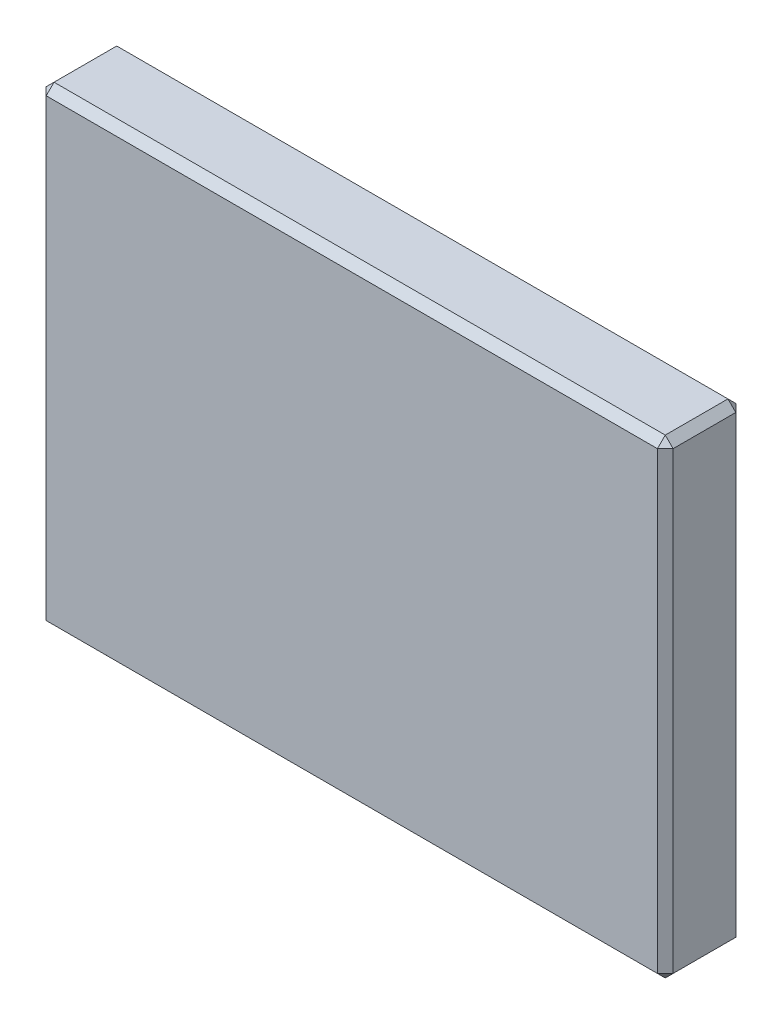
ISO-10303-21;
HEADER;
FILE_DESCRIPTION(('STEP AP214'),'2;1');
FILE_NAME('part.step','',(''),(''),'','','');
FILE_SCHEMA(('AUTOMOTIVE_DESIGN { 1 0 10303 214 1 1 1 1 }'));
ENDSEC;
DATA;
#1=APPLICATION_CONTEXT('core data for automotive mechanical design processes');
#2=APPLICATION_PROTOCOL_DEFINITION('international standard','automotive_design',2000,#1);
#3=PRODUCT_CONTEXT('',#1,'mechanical');
#4=PRODUCT('Part','Part','',(#3));
#5=PRODUCT_RELATED_PRODUCT_CATEGORY('part','',(#4));
#6=PRODUCT_DEFINITION_FORMATION('','',#4);
#7=PRODUCT_DEFINITION_CONTEXT('part definition',#1,'design');
#8=PRODUCT_DEFINITION('design','',#6,#7);
#9=PRODUCT_DEFINITION_SHAPE('','',#8);
#10=(LENGTH_UNIT() NAMED_UNIT(*) SI_UNIT(.MILLI.,.METRE.));
#11=(NAMED_UNIT(*) PLANE_ANGLE_UNIT() SI_UNIT($,.RADIAN.));
#12=(NAMED_UNIT(*) SI_UNIT($,.STERADIAN.) SOLID_ANGLE_UNIT());
#13=UNCERTAINTY_MEASURE_WITH_UNIT(LENGTH_MEASURE(1.E-05),#10,'distance_accuracy_value','');
#14=(GEOMETRIC_REPRESENTATION_CONTEXT(3) GLOBAL_UNCERTAINTY_ASSIGNED_CONTEXT((#13)) GLOBAL_UNIT_ASSIGNED_CONTEXT((#10,
#11,#12)) REPRESENTATION_CONTEXT('',''));
#15=CARTESIAN_POINT('',(0.,0.,0.));
#16=DIRECTION('',(0.,0.,1.));
#17=DIRECTION('',(1.,0.,0.));
#18=AXIS2_PLACEMENT_3D('',#15,#16,#17);
#19=CARTESIAN_POINT('',(0.,0.,12.7));
#20=DIRECTION('',(1.,0.,0.));
#21=DIRECTION('',(0.,0.,-1.));
#22=AXIS2_PLACEMENT_3D('',#19,#20,#21);
#23=PLANE('',#22);
#24=DIRECTION('',(0.,1.,0.));
#25=VECTOR('',#24,1.);
#26=CARTESIAN_POINT('',(0.,0.,11.43));
#27=LINE('',#26,#25);
#28=CARTESIAN_POINT('',(0.,1.27000000000001,11.43));
#29=VERTEX_POINT('',#28);
#30=CARTESIAN_POINT('',(0.,74.93,11.43));
#31=VERTEX_POINT('',#30);
#32=EDGE_CURVE('E159',#29,#31,#27,.T.);
#33=ORIENTED_EDGE('',*,*,#32,.T.);
#34=DIRECTION('',(0.,0.,-1.));
#35=VECTOR('',#34,1.);
#36=CARTESIAN_POINT('',(0.,74.93,12.7));
#37=LINE('',#36,#35);
#38=CARTESIAN_POINT('',(0.,74.93,1.27000000000001));
#39=VERTEX_POINT('',#38);
#40=EDGE_CURVE('E162',#31,#39,#37,.T.);
#41=ORIENTED_EDGE('',*,*,#40,.T.);
#42=DIRECTION('',(0.,-1.,0.));
#43=VECTOR('',#42,1.);
#44=CARTESIAN_POINT('',(0.,0.,1.27000000000001));
#45=LINE('',#44,#43);
#46=CARTESIAN_POINT('',(0.,1.27000000000001,1.27000000000001));
#47=VERTEX_POINT('',#46);
#48=EDGE_CURVE('E136',#39,#47,#45,.T.);
#49=ORIENTED_EDGE('',*,*,#48,.T.);
#50=DIRECTION('',(0.,0.,1.));
#51=VECTOR('',#50,1.);
#52=CARTESIAN_POINT('',(0.,1.27000000000001,12.7));
#53=LINE('',#52,#51);
#54=EDGE_CURVE('E152',#47,#29,#53,.T.);
#55=ORIENTED_EDGE('',*,*,#54,.T.);
#56=EDGE_LOOP('',(#33,#41,#49,#55));
#57=FACE_BOUND('',#56,.T.);
#58=ADVANCED_FACE('F41',(#57),#23,.F.);
#59=CARTESIAN_POINT('',(0.,0.,12.7));
#60=DIRECTION('',(0.,1.,0.));
#61=DIRECTION('',(0.,0.,1.));
#62=AXIS2_PLACEMENT_3D('',#59,#60,#61);
#63=PLANE('',#62);
#64=DIRECTION('',(0.,0.,-1.));
#65=VECTOR('',#64,1.);
#66=CARTESIAN_POINT('',(1.26999999999999,0.,12.7));
#67=LINE('',#66,#65);
#68=CARTESIAN_POINT('',(1.26999999999999,0.,11.43));
#69=VERTEX_POINT('',#68);
#70=CARTESIAN_POINT('',(1.26999999999999,0.,1.26999999999999));
#71=VERTEX_POINT('',#70);
#72=EDGE_CURVE('E176',#69,#71,#67,.T.);
#73=ORIENTED_EDGE('',*,*,#72,.T.);
#74=DIRECTION('',(1.,0.,0.));
#75=VECTOR('',#74,1.);
#76=CARTESIAN_POINT('',(101.6,0.,1.26999999999999));
#77=LINE('',#76,#75);
#78=CARTESIAN_POINT('',(100.33,0.,1.26999999999999));
#79=VERTEX_POINT('',#78);
#80=EDGE_CURVE('E185',#71,#79,#77,.T.);
#81=ORIENTED_EDGE('',*,*,#80,.T.);
#82=DIRECTION('',(0.,0.,1.));
#83=VECTOR('',#82,1.);
#84=CARTESIAN_POINT('',(100.33,0.,12.7));
#85=LINE('',#84,#83);
#86=CARTESIAN_POINT('',(100.33,0.,11.43));
#87=VERTEX_POINT('',#86);
#88=EDGE_CURVE('E179',#79,#87,#85,.T.);
#89=ORIENTED_EDGE('',*,*,#88,.T.);
#90=DIRECTION('',(-1.,0.,0.));
#91=VECTOR('',#90,1.);
#92=CARTESIAN_POINT('',(0.,0.,11.43));
#93=LINE('',#92,#91);
#94=EDGE_CURVE('E177',#87,#69,#93,.T.);
#95=ORIENTED_EDGE('',*,*,#94,.T.);
#96=EDGE_LOOP('',(#73,#81,#89,#95));
#97=FACE_BOUND('',#96,.T.);
#98=ADVANCED_FACE('F335',(#97),#63,.F.);
#99=CARTESIAN_POINT('',(101.6,0.,12.7));
#100=DIRECTION('',(-1.,0.,0.));
#101=DIRECTION('',(0.,0.,1.));
#102=AXIS2_PLACEMENT_3D('',#99,#100,#101);
#103=PLANE('',#102);
#104=DIRECTION('',(0.,0.,-1.));
#105=VECTOR('',#104,1.);
#106=CARTESIAN_POINT('',(101.6,1.27000000000001,12.7));
#107=LINE('',#106,#105);
#108=CARTESIAN_POINT('',(101.6,1.27000000000001,11.43));
#109=VERTEX_POINT('',#108);
#110=CARTESIAN_POINT('',(101.6,1.27000000000001,1.26999999999999));
#111=VERTEX_POINT('',#110);
#112=EDGE_CURVE('E183',#109,#111,#107,.T.);
#113=ORIENTED_EDGE('',*,*,#112,.T.);
#114=DIRECTION('',(0.,1.,0.));
#115=VECTOR('',#114,1.);
#116=CARTESIAN_POINT('',(101.6,76.2,1.26999999999999));
#117=LINE('',#116,#115);
#118=CARTESIAN_POINT('',(101.6,74.93,1.26999999999999));
#119=VERTEX_POINT('',#118);
#120=EDGE_CURVE('E191',#111,#119,#117,.T.);
#121=ORIENTED_EDGE('',*,*,#120,.T.);
#122=DIRECTION('',(0.,0.,1.));
#123=VECTOR('',#122,1.);
#124=CARTESIAN_POINT('',(101.6,74.93,12.7));
#125=LINE('',#124,#123);
#126=CARTESIAN_POINT('',(101.6,74.93,11.43));
#127=VERTEX_POINT('',#126);
#128=EDGE_CURVE('E186',#119,#127,#125,.T.);
#129=ORIENTED_EDGE('',*,*,#128,.T.);
#130=DIRECTION('',(0.,-1.,0.));
#131=VECTOR('',#130,1.);
#132=CARTESIAN_POINT('',(101.6,0.,11.43));
#133=LINE('',#132,#131);
#134=EDGE_CURVE('E190',#127,#109,#133,.T.);
#135=ORIENTED_EDGE('',*,*,#134,.T.);
#136=EDGE_LOOP('',(#113,#121,#129,#135));
#137=FACE_BOUND('',#136,.T.);
#138=ADVANCED_FACE('F305',(#137),#103,.F.);
#139=CARTESIAN_POINT('',(0.,76.2,12.7));
#140=DIRECTION('',(0.,-1.,0.));
#141=DIRECTION('',(0.,0.,-1.));
#142=AXIS2_PLACEMENT_3D('',#139,#140,#141);
#143=PLANE('',#142);
#144=DIRECTION('',(0.,0.,-1.));
#145=VECTOR('',#144,1.);
#146=CARTESIAN_POINT('',(100.33,76.2,12.7));
#147=LINE('',#146,#145);
#148=CARTESIAN_POINT('',(100.33,76.2,11.43));
#149=VERTEX_POINT('',#148);
#150=CARTESIAN_POINT('',(100.33,76.2,1.26999999999999));
#151=VERTEX_POINT('',#150);
#152=EDGE_CURVE('E193',#149,#151,#147,.T.);
#153=ORIENTED_EDGE('',*,*,#152,.T.);
#154=DIRECTION('',(-1.,0.,0.));
#155=VECTOR('',#154,1.);
#156=CARTESIAN_POINT('',(0.,76.2,1.26999999999999));
#157=LINE('',#156,#155);
#158=CARTESIAN_POINT('',(1.26999999999999,76.2,1.26999999999999));
#159=VERTEX_POINT('',#158);
#160=EDGE_CURVE('E199',#151,#159,#157,.T.);
#161=ORIENTED_EDGE('',*,*,#160,.T.);
#162=DIRECTION('',(0.,0.,1.));
#163=VECTOR('',#162,1.);
#164=CARTESIAN_POINT('',(1.26999999999999,76.2,12.7));
#165=LINE('',#164,#163);
#166=CARTESIAN_POINT('',(1.26999999999999,76.2,11.43));
#167=VERTEX_POINT('',#166);
#168=EDGE_CURVE('E196',#159,#167,#165,.T.);
#169=ORIENTED_EDGE('',*,*,#168,.T.);
#170=DIRECTION('',(1.,0.,0.));
#171=VECTOR('',#170,1.);
#172=CARTESIAN_POINT('',(0.,76.2,11.43));
#173=LINE('',#172,#171);
#174=EDGE_CURVE('E198',#167,#149,#173,.T.);
#175=ORIENTED_EDGE('',*,*,#174,.T.);
#176=EDGE_LOOP('',(#153,#161,#169,#175));
#177=FACE_BOUND('',#176,.T.);
#178=ADVANCED_FACE('F274',(#177),#143,.F.);
#179=CARTESIAN_POINT('',(0.,0.,12.7));
#180=DIRECTION('',(0.,0.,-1.));
#181=DIRECTION('',(-1.,0.,0.));
#182=AXIS2_PLACEMENT_3D('',#179,#180,#181);
#183=PLANE('',#182);
#184=DIRECTION('',(-1.,0.,0.));
#185=VECTOR('',#184,1.);
#186=CARTESIAN_POINT('',(0.,74.93,12.7));
#187=LINE('',#186,#185);
#188=CARTESIAN_POINT('',(100.33,74.93,12.7));
#189=VERTEX_POINT('',#188);
#190=CARTESIAN_POINT('',(1.26999999999999,74.93,12.7));
#191=VERTEX_POINT('',#190);
#192=EDGE_CURVE('E51',#189,#191,#187,.T.);
#193=ORIENTED_EDGE('',*,*,#192,.T.);
#194=DIRECTION('',(0.,-1.,0.));
#195=VECTOR('',#194,1.);
#196=CARTESIAN_POINT('',(1.26999999999999,0.,12.7));
#197=LINE('',#196,#195);
#198=CARTESIAN_POINT('',(1.26999999999999,1.27000000000001,12.7));
#199=VERTEX_POINT('',#198);
#200=EDGE_CURVE('E11',#191,#199,#197,.T.);
#201=ORIENTED_EDGE('',*,*,#200,.T.);
#202=DIRECTION('',(1.,0.,0.));
#203=VECTOR('',#202,1.);
#204=CARTESIAN_POINT('',(0.,1.27000000000001,12.7));
#205=LINE('',#204,#203);
#206=CARTESIAN_POINT('',(100.33,1.27000000000001,12.7));
#207=VERTEX_POINT('',#206);
#208=EDGE_CURVE('E201',#199,#207,#205,.T.);
#209=ORIENTED_EDGE('',*,*,#208,.T.);
#210=DIRECTION('',(0.,1.,0.));
#211=VECTOR('',#210,1.);
#212=CARTESIAN_POINT('',(100.33,0.,12.7));
#213=LINE('',#212,#211);
#214=EDGE_CURVE('E65',#207,#189,#213,.T.);
#215=ORIENTED_EDGE('',*,*,#214,.T.);
#216=EDGE_LOOP('',(#193,#201,#209,#215));
#217=FACE_BOUND('',#216,.T.);
#218=ADVANCED_FACE('F289',(#217),#183,.F.);
#219=CARTESIAN_POINT('',(0.,0.,0.));
#220=DIRECTION('',(0.,0.,-1.));
#221=DIRECTION('',(-1.,0.,0.));
#222=AXIS2_PLACEMENT_3D('',#219,#220,#221);
#223=PLANE('',#222);
#224=DIRECTION('',(-1.,0.,0.));
#225=VECTOR('',#224,1.);
#226=CARTESIAN_POINT('',(0.,1.27000000000001,0.));
#227=LINE('',#226,#225);
#228=CARTESIAN_POINT('',(100.33,1.27000000000001,0.));
#229=VERTEX_POINT('',#228);
#230=CARTESIAN_POINT('',(1.26999999999999,1.27000000000001,0.));
#231=VERTEX_POINT('',#230);
#232=EDGE_CURVE('E174',#229,#231,#227,.T.);
#233=ORIENTED_EDGE('',*,*,#232,.T.);
#234=DIRECTION('',(0.,1.,0.));
#235=VECTOR('',#234,1.);
#236=CARTESIAN_POINT('',(1.26999999999999,76.2,0.));
#237=LINE('',#236,#235);
#238=CARTESIAN_POINT('',(1.26999999999999,74.93,0.));
#239=VERTEX_POINT('',#238);
#240=EDGE_CURVE('E137',#231,#239,#237,.T.);
#241=ORIENTED_EDGE('',*,*,#240,.T.);
#242=DIRECTION('',(1.,0.,0.));
#243=VECTOR('',#242,1.);
#244=CARTESIAN_POINT('',(101.6,74.93,0.));
#245=LINE('',#244,#243);
#246=CARTESIAN_POINT('',(100.33,74.93,0.));
#247=VERTEX_POINT('',#246);
#248=EDGE_CURVE('E167',#239,#247,#245,.T.);
#249=ORIENTED_EDGE('',*,*,#248,.T.);
#250=DIRECTION('',(0.,-1.,0.));
#251=VECTOR('',#250,1.);
#252=CARTESIAN_POINT('',(100.33,0.,0.));
#253=LINE('',#252,#251);
#254=EDGE_CURVE('E172',#247,#229,#253,.T.);
#255=ORIENTED_EDGE('',*,*,#254,.T.);
#256=EDGE_LOOP('',(#233,#241,#249,#255));
#257=FACE_BOUND('',#256,.T.);
#258=ADVANCED_FACE('F425',(#257),#223,.T.);
#259=CARTESIAN_POINT('',(100.33,0.,12.7));
#260=DIRECTION('',(-0.707106781186551,0.,-0.707106781186544));
#261=DIRECTION('',(0.,1.,0.));
#262=AXIS2_PLACEMENT_3D('',#259,#260,#261);
#263=PLANE('',#262);
#264=DIRECTION('',(-0.707106781186544,0.,0.707106781186551));
#265=VECTOR('',#264,1.);
#266=CARTESIAN_POINT('',(100.965,74.93,12.065));
#267=LINE('',#266,#265);
#268=EDGE_CURVE('E46',#189,#127,#267,.F.);
#269=ORIENTED_EDGE('',*,*,#268,.F.);
#270=ORIENTED_EDGE('',*,*,#214,.F.);
#271=DIRECTION('',(0.707106781186544,0.,-0.707106781186551));
#272=VECTOR('',#271,1.);
#273=CARTESIAN_POINT('',(101.6,1.27000000000001,11.43));
#274=LINE('',#273,#272);
#275=EDGE_CURVE('E254',#109,#207,#274,.F.);
#276=ORIENTED_EDGE('',*,*,#275,.F.);
#277=ORIENTED_EDGE('',*,*,#134,.F.);
#278=EDGE_LOOP('',(#269,#270,#276,#277));
#279=FACE_BOUND('',#278,.T.);
#280=ADVANCED_FACE('F42',(#279),#263,.F.);
#281=CARTESIAN_POINT('',(100.33,76.2,11.43));
#282=DIRECTION('',(0.577350269189632,0.577350269189626,0.577350269189619));
#283=DIRECTION('',(-0.707106781186544,0.707106781186551,0.));
#284=AXIS2_PLACEMENT_3D('',#281,#282,#283);
#285=PLANE('',#284);
#286=DIRECTION('',(0.,0.707106781186544,-0.707106781186551));
#287=VECTOR('',#286,1.);
#288=CARTESIAN_POINT('',(100.33,76.2,11.43));
#289=LINE('',#288,#287);
#290=EDGE_CURVE('E249',#189,#149,#289,.T.);
#291=ORIENTED_EDGE('',*,*,#290,.F.);
#292=ORIENTED_EDGE('',*,*,#268,.T.);
#293=DIRECTION('',(0.707106781186544,-0.707106781186551,0.));
#294=VECTOR('',#293,1.);
#295=CARTESIAN_POINT('',(100.33,76.2,11.43));
#296=LINE('',#295,#294);
#297=EDGE_CURVE('E251',#149,#127,#296,.T.);
#298=ORIENTED_EDGE('',*,*,#297,.F.);
#299=EDGE_LOOP('',(#291,#292,#298));
#300=FACE_BOUND('',#299,.T.);
#301=ADVANCED_FACE('F264',(#300),#285,.T.);
#302=CARTESIAN_POINT('',(101.6,1.27000000000001,11.43));
#303=DIRECTION('',(0.577350269189632,-0.577350269189619,0.577350269189626));
#304=DIRECTION('',(0.707106781186544,0.,-0.707106781186551));
#305=AXIS2_PLACEMENT_3D('',#302,#303,#304);
#306=PLANE('',#305);
#307=DIRECTION('',(-0.707106781186544,-0.707106781186552,0.));
#308=VECTOR('',#307,1.);
#309=CARTESIAN_POINT('',(101.6,1.27000000000001,11.43));
#310=LINE('',#309,#308);
#311=EDGE_CURVE('E241',#109,#87,#310,.T.);
#312=ORIENTED_EDGE('',*,*,#311,.F.);
#313=ORIENTED_EDGE('',*,*,#275,.T.);
#314=DIRECTION('',(0.,0.707106781186551,0.707106781186544));
#315=VECTOR('',#314,1.);
#316=CARTESIAN_POINT('',(100.33,0.635000000000004,12.065));
#317=LINE('',#316,#315);
#318=EDGE_CURVE('E250',#87,#207,#317,.T.);
#319=ORIENTED_EDGE('',*,*,#318,.F.);
#320=EDGE_LOOP('',(#312,#313,#319));
#321=FACE_BOUND('',#320,.T.);
#322=ADVANCED_FACE('F294',(#321),#306,.T.);
#323=CARTESIAN_POINT('',(100.33,76.2,12.7));
#324=DIRECTION('',(-0.707106781186551,-0.707106781186544,0.));
#325=DIRECTION('',(0.,0.,-1.));
#326=AXIS2_PLACEMENT_3D('',#323,#324,#325);
#327=PLANE('',#326);
#328=ORIENTED_EDGE('',*,*,#297,.T.);
#329=ORIENTED_EDGE('',*,*,#128,.F.);
#330=DIRECTION('',(-0.707106781186544,0.707106781186551,0.));
#331=VECTOR('',#330,1.);
#332=CARTESIAN_POINT('',(101.6,74.93,1.26999999999999));
#333=LINE('',#332,#331);
#334=EDGE_CURVE('E239',#151,#119,#333,.F.);
#335=ORIENTED_EDGE('',*,*,#334,.F.);
#336=ORIENTED_EDGE('',*,*,#152,.F.);
#337=EDGE_LOOP('',(#328,#329,#335,#336));
#338=FACE_BOUND('',#337,.T.);
#339=ADVANCED_FACE('F271',(#338),#327,.F.);
#340=CARTESIAN_POINT('',(0.,74.93,12.7));
#341=DIRECTION('',(0.,-0.707106781186551,-0.707106781186544));
#342=DIRECTION('',(-1.,0.,0.));
#343=AXIS2_PLACEMENT_3D('',#340,#341,#342);
#344=PLANE('',#343);
#345=ORIENTED_EDGE('',*,*,#290,.T.);
#346=ORIENTED_EDGE('',*,*,#174,.F.);
#347=DIRECTION('',(0.,-0.707106781186544,0.707106781186551));
#348=VECTOR('',#347,1.);
#349=CARTESIAN_POINT('',(1.26999999999999,75.565,12.065));
#350=LINE('',#349,#348);
#351=EDGE_CURVE('E237',#191,#167,#350,.F.);
#352=ORIENTED_EDGE('',*,*,#351,.F.);
#353=ORIENTED_EDGE('',*,*,#192,.F.);
#354=EDGE_LOOP('',(#345,#346,#352,#353));
#355=FACE_BOUND('',#354,.T.);
#356=ADVANCED_FACE('F282',(#355),#344,.F.);
#357=CARTESIAN_POINT('',(1.26999999999999,0.,12.7));
#358=DIRECTION('',(0.707106781186551,0.,-0.707106781186544));
#359=DIRECTION('',(0.,-1.,0.));
#360=AXIS2_PLACEMENT_3D('',#357,#358,#359);
#361=PLANE('',#360);
#362=DIRECTION('',(0.707106781186544,0.,0.707106781186551));
#363=VECTOR('',#362,1.);
#364=CARTESIAN_POINT('',(1.26999999999999,1.27000000000001,12.7));
#365=LINE('',#364,#363);
#366=EDGE_CURVE('E228',#199,#29,#365,.F.);
#367=ORIENTED_EDGE('',*,*,#366,.F.);
#368=ORIENTED_EDGE('',*,*,#200,.F.);
#369=DIRECTION('',(-0.707106781186544,0.,-0.707106781186551));
#370=VECTOR('',#369,1.);
#371=CARTESIAN_POINT('',(0.,74.93,11.43));
#372=LINE('',#371,#370);
#373=EDGE_CURVE('E232',#31,#191,#372,.F.);
#374=ORIENTED_EDGE('',*,*,#373,.F.);
#375=ORIENTED_EDGE('',*,*,#32,.F.);
#376=EDGE_LOOP('',(#367,#368,#374,#375));
#377=FACE_BOUND('',#376,.T.);
#378=ADVANCED_FACE('F287',(#377),#361,.F.);
#379=CARTESIAN_POINT('',(0.,1.27000000000001,12.7));
#380=DIRECTION('',(0.,0.707106781186544,-0.707106781186551));
#381=DIRECTION('',(1.,0.,0.));
#382=AXIS2_PLACEMENT_3D('',#379,#380,#381);
#383=PLANE('',#382);
#384=ORIENTED_EDGE('',*,*,#318,.T.);
#385=ORIENTED_EDGE('',*,*,#208,.F.);
#386=DIRECTION('',(0.,-0.707106781186551,-0.707106781186544));
#387=VECTOR('',#386,1.);
#388=CARTESIAN_POINT('',(1.26999999999999,1.27000000000001,12.7));
#389=LINE('',#388,#387);
#390=EDGE_CURVE('E229',#69,#199,#389,.F.);
#391=ORIENTED_EDGE('',*,*,#390,.F.);
#392=ORIENTED_EDGE('',*,*,#94,.F.);
#393=EDGE_LOOP('',(#384,#385,#391,#392));
#394=FACE_BOUND('',#393,.T.);
#395=ADVANCED_FACE('F396',(#394),#383,.F.);
#396=CARTESIAN_POINT('',(101.6,1.27000000000001,12.7));
#397=DIRECTION('',(-0.707106781186551,0.707106781186544,0.));
#398=DIRECTION('',(0.,0.,-1.));
#399=AXIS2_PLACEMENT_3D('',#396,#397,#398);
#400=PLANE('',#399);
#401=ORIENTED_EDGE('',*,*,#311,.T.);
#402=ORIENTED_EDGE('',*,*,#88,.F.);
#403=DIRECTION('',(0.707106781186544,0.707106781186551,0.));
#404=VECTOR('',#403,1.);
#405=CARTESIAN_POINT('',(100.33,0.,1.26999999999999));
#406=LINE('',#405,#404);
#407=EDGE_CURVE('E223',#111,#79,#406,.F.);
#408=ORIENTED_EDGE('',*,*,#407,.F.);
#409=ORIENTED_EDGE('',*,*,#112,.F.);
#410=EDGE_LOOP('',(#401,#402,#408,#409));
#411=FACE_BOUND('',#410,.T.);
#412=ADVANCED_FACE('F296',(#411),#400,.F.);
#413=CARTESIAN_POINT('',(101.6,0.,1.26999999999999));
#414=DIRECTION('',(0.707106781186544,0.,-0.707106781186551));
#415=DIRECTION('',(0.,-1.,0.));
#416=AXIS2_PLACEMENT_3D('',#413,#414,#415);
#417=PLANE('',#416);
#418=DIRECTION('',(-0.707106781186551,0.,-0.707106781186544));
#419=VECTOR('',#418,1.);
#420=CARTESIAN_POINT('',(101.6,74.93,1.26999999999999));
#421=LINE('',#420,#419);
#422=EDGE_CURVE('E242',#119,#247,#421,.T.);
#423=ORIENTED_EDGE('',*,*,#422,.F.);
#424=ORIENTED_EDGE('',*,*,#120,.F.);
#425=DIRECTION('',(0.707106781186551,0.,0.707106781186544));
#426=VECTOR('',#425,1.);
#427=CARTESIAN_POINT('',(100.965,1.27000000000001,0.634999999999997));
#428=LINE('',#427,#426);
#429=EDGE_CURVE('E225',#229,#111,#428,.T.);
#430=ORIENTED_EDGE('',*,*,#429,.F.);
#431=ORIENTED_EDGE('',*,*,#254,.F.);
#432=EDGE_LOOP('',(#423,#424,#430,#431));
#433=FACE_BOUND('',#432,.T.);
#434=ADVANCED_FACE('F308',(#433),#417,.T.);
#435=CARTESIAN_POINT('',(101.6,74.93,1.26999999999999));
#436=DIRECTION('',(0.577350269189626,0.577350269189619,-0.577350269189632));
#437=DIRECTION('',(-0.707106781186551,0.,-0.707106781186544));
#438=AXIS2_PLACEMENT_3D('',#435,#436,#437);
#439=PLANE('',#438);
#440=ORIENTED_EDGE('',*,*,#334,.T.);
#441=ORIENTED_EDGE('',*,*,#422,.T.);
#442=DIRECTION('',(0.,0.707106781186551,0.707106781186544));
#443=VECTOR('',#442,1.);
#444=CARTESIAN_POINT('',(100.33,75.565,0.634999999999997));
#445=LINE('',#444,#443);
#446=EDGE_CURVE('E218',#151,#247,#445,.F.);
#447=ORIENTED_EDGE('',*,*,#446,.F.);
#448=EDGE_LOOP('',(#440,#441,#447));
#449=FACE_BOUND('',#448,.T.);
#450=ADVANCED_FACE('F309',(#449),#439,.T.);
#451=CARTESIAN_POINT('',(0.,74.93,11.43));
#452=DIRECTION('',(-0.577350269189632,0.577350269189626,0.577350269189619));
#453=DIRECTION('',(-0.707106781186544,-0.707106781186551,0.));
#454=AXIS2_PLACEMENT_3D('',#451,#452,#453);
#455=PLANE('',#454);
#456=ORIENTED_EDGE('',*,*,#373,.T.);
#457=ORIENTED_EDGE('',*,*,#351,.T.);
#458=DIRECTION('',(0.707106781186544,0.707106781186551,0.));
#459=VECTOR('',#458,1.);
#460=CARTESIAN_POINT('',(0.,74.93,11.43));
#461=LINE('',#460,#459);
#462=EDGE_CURVE('E216',#31,#167,#461,.T.);
#463=ORIENTED_EDGE('',*,*,#462,.F.);
#464=EDGE_LOOP('',(#456,#457,#463));
#465=FACE_BOUND('',#464,.T.);
#466=ADVANCED_FACE('F283',(#465),#455,.T.);
#467=CARTESIAN_POINT('',(1.26999999999999,1.27000000000001,12.7));
#468=DIRECTION('',(-0.577350269189632,-0.577350269189619,0.577350269189626));
#469=DIRECTION('',(0.707106781186544,0.,0.707106781186551));
#470=AXIS2_PLACEMENT_3D('',#467,#468,#469);
#471=PLANE('',#470);
#472=ORIENTED_EDGE('',*,*,#390,.T.);
#473=ORIENTED_EDGE('',*,*,#366,.T.);
#474=DIRECTION('',(-0.707106781186544,0.707106781186552,0.));
#475=VECTOR('',#474,1.);
#476=CARTESIAN_POINT('',(0.634999999999996,0.635000000000004,11.43));
#477=LINE('',#476,#475);
#478=EDGE_CURVE('E160',#69,#29,#477,.T.);
#479=ORIENTED_EDGE('',*,*,#478,.F.);
#480=EDGE_LOOP('',(#472,#473,#479));
#481=FACE_BOUND('',#480,.T.);
#482=ADVANCED_FACE('F374',(#481),#471,.T.);
#483=CARTESIAN_POINT('',(100.33,0.,1.26999999999999));
#484=DIRECTION('',(0.577350269189626,-0.57735026918962,-0.577350269189632));
#485=DIRECTION('',(-0.707106781186551,0.,-0.707106781186544));
#486=AXIS2_PLACEMENT_3D('',#483,#484,#485);
#487=PLANE('',#486);
#488=ORIENTED_EDGE('',*,*,#429,.T.);
#489=ORIENTED_EDGE('',*,*,#407,.T.);
#490=DIRECTION('',(0.,0.707106781186551,-0.707106781186544));
#491=VECTOR('',#490,1.);
#492=CARTESIAN_POINT('',(100.33,0.,1.26999999999999));
#493=LINE('',#492,#491);
#494=EDGE_CURVE('E213',#229,#79,#493,.F.);
#495=ORIENTED_EDGE('',*,*,#494,.F.);
#496=EDGE_LOOP('',(#488,#489,#495));
#497=FACE_BOUND('',#496,.T.);
#498=ADVANCED_FACE('F367',(#497),#487,.T.);
#499=CARTESIAN_POINT('',(0.,76.2,1.26999999999999));
#500=DIRECTION('',(0.,0.707106781186544,-0.707106781186551));
#501=DIRECTION('',(1.,0.,0.));
#502=AXIS2_PLACEMENT_3D('',#499,#500,#501);
#503=PLANE('',#502);
#504=ORIENTED_EDGE('',*,*,#446,.T.);
#505=ORIENTED_EDGE('',*,*,#248,.F.);
#506=DIRECTION('',(0.,-0.707106781186551,-0.707106781186544));
#507=VECTOR('',#506,1.);
#508=CARTESIAN_POINT('',(1.26999999999999,74.93,0.));
#509=LINE('',#508,#507);
#510=EDGE_CURVE('E209',#159,#239,#509,.T.);
#511=ORIENTED_EDGE('',*,*,#510,.F.);
#512=ORIENTED_EDGE('',*,*,#160,.F.);
#513=EDGE_LOOP('',(#504,#505,#511,#512));
#514=FACE_BOUND('',#513,.T.);
#515=ADVANCED_FACE('F311',(#514),#503,.T.);
#516=CARTESIAN_POINT('',(0.,74.93,12.7));
#517=DIRECTION('',(0.707106781186551,-0.707106781186544,0.));
#518=DIRECTION('',(0.,0.,-1.));
#519=AXIS2_PLACEMENT_3D('',#516,#517,#518);
#520=PLANE('',#519);
#521=ORIENTED_EDGE('',*,*,#462,.T.);
#522=ORIENTED_EDGE('',*,*,#168,.F.);
#523=DIRECTION('',(-0.707106781186544,-0.707106781186552,0.));
#524=VECTOR('',#523,1.);
#525=CARTESIAN_POINT('',(0.634999999999996,75.565,1.27));
#526=LINE('',#525,#524);
#527=EDGE_CURVE('E151',#39,#159,#526,.F.);
#528=ORIENTED_EDGE('',*,*,#527,.F.);
#529=ORIENTED_EDGE('',*,*,#40,.F.);
#530=EDGE_LOOP('',(#521,#522,#528,#529));
#531=FACE_BOUND('',#530,.T.);
#532=ADVANCED_FACE('F318',(#531),#520,.F.);
#533=CARTESIAN_POINT('',(1.26999999999999,0.,12.7));
#534=DIRECTION('',(0.707106781186551,0.707106781186544,0.));
#535=DIRECTION('',(0.,0.,-1.));
#536=AXIS2_PLACEMENT_3D('',#533,#534,#535);
#537=PLANE('',#536);
#538=ORIENTED_EDGE('',*,*,#478,.T.);
#539=ORIENTED_EDGE('',*,*,#54,.F.);
#540=DIRECTION('',(0.707106781186544,-0.707106781186552,0.));
#541=VECTOR('',#540,1.);
#542=CARTESIAN_POINT('',(0.,1.27000000000001,1.27000000000001));
#543=LINE('',#542,#541);
#544=EDGE_CURVE('E145',#71,#47,#543,.F.);
#545=ORIENTED_EDGE('',*,*,#544,.F.);
#546=ORIENTED_EDGE('',*,*,#72,.F.);
#547=EDGE_LOOP('',(#538,#539,#545,#546));
#548=FACE_BOUND('',#547,.T.);
#549=ADVANCED_FACE('F154',(#548),#537,.F.);
#550=CARTESIAN_POINT('',(0.,0.,1.26999999999999));
#551=DIRECTION('',(0.,-0.707106781186544,-0.707106781186551));
#552=DIRECTION('',(-1.,0.,0.));
#553=AXIS2_PLACEMENT_3D('',#550,#551,#552);
#554=PLANE('',#553);
#555=ORIENTED_EDGE('',*,*,#494,.T.);
#556=ORIENTED_EDGE('',*,*,#80,.F.);
#557=DIRECTION('',(0.,-0.707106781186551,0.707106781186544));
#558=VECTOR('',#557,1.);
#559=CARTESIAN_POINT('',(1.26999999999999,0.635000000000004,0.634999999999997));
#560=LINE('',#559,#558);
#561=EDGE_CURVE('E146',#231,#71,#560,.T.);
#562=ORIENTED_EDGE('',*,*,#561,.F.);
#563=ORIENTED_EDGE('',*,*,#232,.F.);
#564=EDGE_LOOP('',(#555,#556,#562,#563));
#565=FACE_BOUND('',#564,.T.);
#566=ADVANCED_FACE('F321',(#565),#554,.T.);
#567=CARTESIAN_POINT('',(1.26999999999999,74.93,0.));
#568=DIRECTION('',(-0.577350269189632,0.577350269189619,-0.577350269189626));
#569=DIRECTION('',(-0.707106781186544,0.,0.707106781186551));
#570=AXIS2_PLACEMENT_3D('',#567,#568,#569);
#571=PLANE('',#570);
#572=ORIENTED_EDGE('',*,*,#527,.T.);
#573=ORIENTED_EDGE('',*,*,#510,.T.);
#574=DIRECTION('',(-0.707106781186544,0.,0.707106781186551));
#575=VECTOR('',#574,1.);
#576=CARTESIAN_POINT('',(1.26999999999999,74.93,0.));
#577=LINE('',#576,#575);
#578=EDGE_CURVE('E143',#39,#239,#577,.F.);
#579=ORIENTED_EDGE('',*,*,#578,.F.);
#580=EDGE_LOOP('',(#572,#573,#579));
#581=FACE_BOUND('',#580,.T.);
#582=ADVANCED_FACE('F317',(#581),#571,.T.);
#583=CARTESIAN_POINT('',(0.,1.27000000000001,1.27000000000001));
#584=DIRECTION('',(-0.577350269189632,-0.577350269189619,-0.577350269189626));
#585=DIRECTION('',(-0.707106781186544,0.,0.707106781186551));
#586=AXIS2_PLACEMENT_3D('',#583,#584,#585);
#587=PLANE('',#586);
#588=ORIENTED_EDGE('',*,*,#561,.T.);
#589=ORIENTED_EDGE('',*,*,#544,.T.);
#590=DIRECTION('',(0.707106781186544,0.,-0.707106781186551));
#591=VECTOR('',#590,1.);
#592=CARTESIAN_POINT('',(0.,1.27000000000001,1.27000000000001));
#593=LINE('',#592,#591);
#594=EDGE_CURVE('E135',#231,#47,#593,.F.);
#595=ORIENTED_EDGE('',*,*,#594,.F.);
#596=EDGE_LOOP('',(#588,#589,#595));
#597=FACE_BOUND('',#596,.T.);
#598=ADVANCED_FACE('F148',(#597),#587,.T.);
#599=CARTESIAN_POINT('',(0.,0.,1.27000000000001));
#600=DIRECTION('',(-0.707106781186551,0.,-0.707106781186544));
#601=DIRECTION('',(0.,1.,0.));
#602=AXIS2_PLACEMENT_3D('',#599,#600,#601);
#603=PLANE('',#602);
#604=ORIENTED_EDGE('',*,*,#578,.T.);
#605=ORIENTED_EDGE('',*,*,#240,.F.);
#606=ORIENTED_EDGE('',*,*,#594,.T.);
#607=ORIENTED_EDGE('',*,*,#48,.F.);
#608=EDGE_LOOP('',(#604,#605,#606,#607));
#609=FACE_BOUND('',#608,.T.);
#610=ADVANCED_FACE('F131',(#609),#603,.T.);
#611=CLOSED_SHELL('',(#58,#98,#138,#178,#218,#258,#280,#301,#322,#339,#356,#378,#395,#412,#434,
#450,#466,#482,#498,#515,#532,#549,#566,#582,#598,#610));
#612=MANIFOLD_SOLID_BREP('B2',#611);
#613=ADVANCED_BREP_SHAPE_REPRESENTATION('',(#18,#612),#14);
#614=SHAPE_DEFINITION_REPRESENTATION(#9,#613);
ENDSEC;
END-ISO-10303-21;
